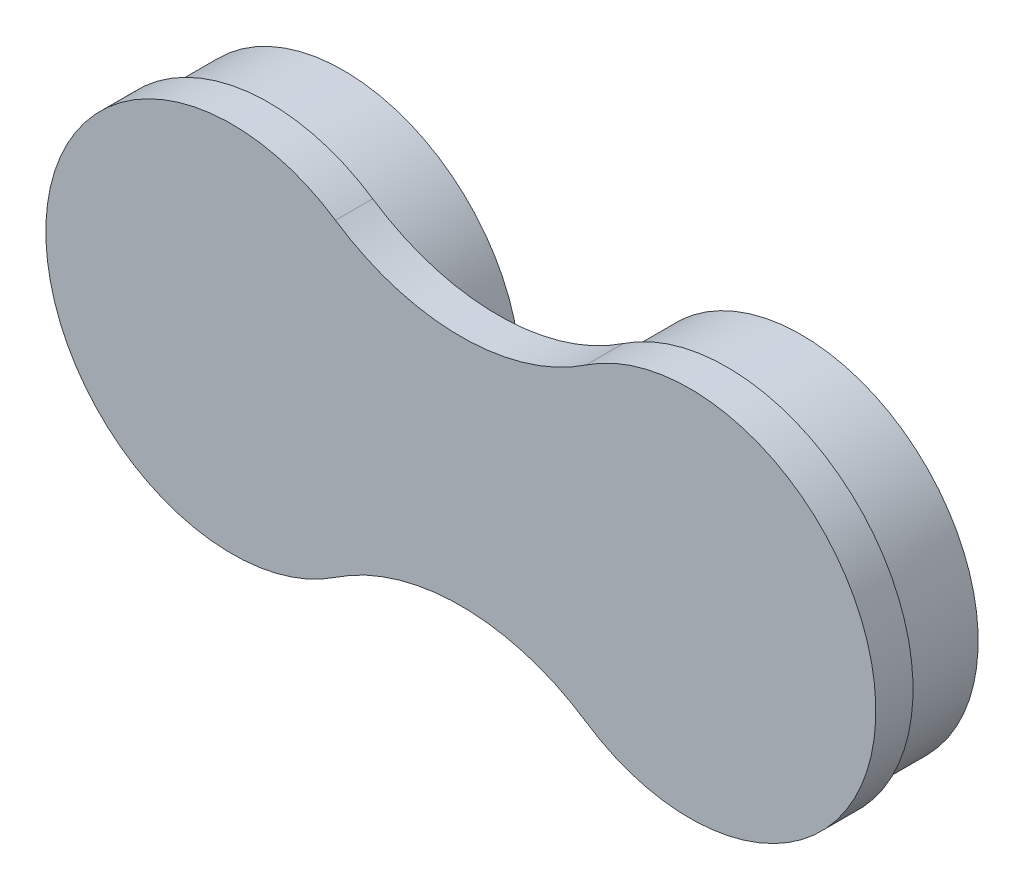
ISO-10303-21;
HEADER;
FILE_DESCRIPTION(('STEP AP214'),'2;1');
FILE_NAME('part.step','',(''),(''),'','','');
FILE_SCHEMA(('AUTOMOTIVE_DESIGN { 1 0 10303 214 1 1 1 1 }'));
ENDSEC;
DATA;
#1=APPLICATION_CONTEXT('core data for automotive mechanical design processes');
#2=APPLICATION_PROTOCOL_DEFINITION('international standard','automotive_design',2000,#1);
#3=PRODUCT_CONTEXT('',#1,'mechanical');
#4=PRODUCT('Part','Part','',(#3));
#5=PRODUCT_RELATED_PRODUCT_CATEGORY('part','',(#4));
#6=PRODUCT_DEFINITION_FORMATION('','',#4);
#7=PRODUCT_DEFINITION_CONTEXT('part definition',#1,'design');
#8=PRODUCT_DEFINITION('design','',#6,#7);
#9=PRODUCT_DEFINITION_SHAPE('','',#8);
#10=(LENGTH_UNIT() NAMED_UNIT(*) SI_UNIT(.MILLI.,.METRE.));
#11=(NAMED_UNIT(*) PLANE_ANGLE_UNIT() SI_UNIT($,.RADIAN.));
#12=(NAMED_UNIT(*) SI_UNIT($,.STERADIAN.) SOLID_ANGLE_UNIT());
#13=UNCERTAINTY_MEASURE_WITH_UNIT(LENGTH_MEASURE(1.E-05),#10,'distance_accuracy_value','');
#14=(GEOMETRIC_REPRESENTATION_CONTEXT(3) GLOBAL_UNCERTAINTY_ASSIGNED_CONTEXT((#13)) GLOBAL_UNIT_ASSIGNED_CONTEXT((#10,
#11,#12)) REPRESENTATION_CONTEXT('',''));
#15=CARTESIAN_POINT('',(0.,0.,0.));
#16=DIRECTION('',(0.,0.,1.));
#17=DIRECTION('',(1.,0.,0.));
#18=AXIS2_PLACEMENT_3D('',#15,#16,#17);
#19=CARTESIAN_POINT('',(3.075,4.59124687907788,2.));
#20=DIRECTION('',(0.,0.,1.));
#21=DIRECTION('',(1.,0.,0.));
#22=AXIS2_PLACEMENT_3D('',#19,#20,#21);
#23=PLANE('',#22);
#24=CARTESIAN_POINT('',(0.,9.18249375815576,2.));
#25=DIRECTION('',(0.,0.,-1.));
#26=DIRECTION('',(1.,0.,0.));
#27=AXIS2_PLACEMENT_3D('',#24,#25,#26);
#28=CIRCLE('',#27,6.05172799242586);
#29=CARTESIAN_POINT('',(3.36762967555173,4.15432490034537,2.));
#30=VERTEX_POINT('',#29);
#31=CARTESIAN_POINT('',(-3.36762967555173,4.15432490034538,2.));
#32=VERTEX_POINT('',#31);
#33=EDGE_CURVE('E101',#30,#32,#28,.T.);
#34=ORIENTED_EDGE('',*,*,#33,.F.);
#35=CARTESIAN_POINT('',(6.15,0.,2.));
#36=DIRECTION('',(0.,0.,1.));
#37=DIRECTION('',(1.,0.,0.));
#38=AXIS2_PLACEMENT_3D('',#35,#36,#37);
#39=CIRCLE('',#38,5.);
#40=CARTESIAN_POINT('',(3.36769025449505,-4.15436547261651,2.));
#41=VERTEX_POINT('',#40);
#42=EDGE_CURVE('E73',#41,#30,#39,.T.);
#43=ORIENTED_EDGE('',*,*,#42,.F.);
#44=CARTESIAN_POINT('',(0.,-9.18278336833941,2.));
#45=DIRECTION('',(0.,0.,-1.));
#46=DIRECTION('',(-1.,0.,0.));
#47=AXIS2_PLACEMENT_3D('',#44,#45,#46);
#48=CIRCLE('',#47,6.05196862056036);
#49=CARTESIAN_POINT('',(-3.36769025449505,-4.15436547261651,2.));
#50=VERTEX_POINT('',#49);
#51=EDGE_CURVE('E67',#50,#41,#48,.T.);
#52=ORIENTED_EDGE('',*,*,#51,.F.);
#53=CARTESIAN_POINT('',(-6.15,0.,2.));
#54=DIRECTION('',(0.,0.,1.));
#55=DIRECTION('',(1.,0.,0.));
#56=AXIS2_PLACEMENT_3D('',#53,#54,#55);
#57=CIRCLE('',#56,5.);
#58=EDGE_CURVE('E91',#32,#50,#57,.T.);
#59=ORIENTED_EDGE('',*,*,#58,.F.);
#60=EDGE_LOOP('',(#34,#43,#52,#59));
#61=FACE_BOUND('',#60,.T.);
#62=CARTESIAN_POINT('',(-6.15,0.,2.));
#63=DIRECTION('',(0.,0.,1.));
#64=DIRECTION('',(1.,0.,0.));
#65=AXIS2_PLACEMENT_3D('',#62,#63,#64);
#66=CIRCLE('',#65,4.75);
#67=CARTESIAN_POINT('',(-1.4,0.,2.));
#68=VERTEX_POINT('',#67);
#69=EDGE_CURVE('E118',#68,#68,#66,.T.);
#70=ORIENTED_EDGE('',*,*,#69,.T.);
#71=EDGE_LOOP('',(#70));
#72=FACE_BOUND('',#71,.T.);
#73=CARTESIAN_POINT('',(6.15,0.,2.));
#74=DIRECTION('',(0.,0.,1.));
#75=DIRECTION('',(1.,0.,0.));
#76=AXIS2_PLACEMENT_3D('',#73,#74,#75);
#77=CIRCLE('',#76,4.75);
#78=CARTESIAN_POINT('',(10.9,0.,2.));
#79=VERTEX_POINT('',#78);
#80=EDGE_CURVE('E11',#79,#79,#77,.F.);
#81=ORIENTED_EDGE('',*,*,#80,.F.);
#82=EDGE_LOOP('',(#81));
#83=FACE_BOUND('',#82,.T.);
#84=ADVANCED_FACE('F33',(#61,#72,#83),#23,.F.);
#85=CARTESIAN_POINT('',(-6.15,0.,2.));
#86=DIRECTION('',(0.,0.,-1.));
#87=DIRECTION('',(-1.,0.,0.));
#88=AXIS2_PLACEMENT_3D('',#85,#86,#87);
#89=CYLINDRICAL_SURFACE('',#88,4.75);
#90=ORIENTED_EDGE('',*,*,#69,.F.);
#91=EDGE_LOOP('',(#90));
#92=FACE_BOUND('',#91,.T.);
#93=CARTESIAN_POINT('',(-6.15,0.,0.));
#94=DIRECTION('',(0.,0.,1.));
#95=DIRECTION('',(1.,0.,0.));
#96=AXIS2_PLACEMENT_3D('',#93,#94,#95);
#97=CIRCLE('',#96,4.75);
#98=CARTESIAN_POINT('',(-1.4,0.,0.));
#99=VERTEX_POINT('',#98);
#100=EDGE_CURVE('E115',#99,#99,#97,.T.);
#101=ORIENTED_EDGE('',*,*,#100,.T.);
#102=EDGE_LOOP('',(#101));
#103=FACE_BOUND('',#102,.T.);
#104=ADVANCED_FACE('F35',(#92,#103),#89,.T.);
#105=CARTESIAN_POINT('',(-6.15,0.,0.));
#106=DIRECTION('',(0.,0.,1.));
#107=DIRECTION('',(1.,0.,0.));
#108=AXIS2_PLACEMENT_3D('',#105,#106,#107);
#109=PLANE('',#108);
#110=CARTESIAN_POINT('',(-6.15,0.,0.));
#111=DIRECTION('',(0.,0.,1.));
#112=DIRECTION('',(1.,0.,0.));
#113=AXIS2_PLACEMENT_3D('',#110,#111,#112);
#114=CIRCLE('',#113,2.25);
#115=CARTESIAN_POINT('',(-3.9,0.,0.));
#116=VERTEX_POINT('',#115);
#117=EDGE_CURVE('E112',#116,#116,#114,.T.);
#118=ORIENTED_EDGE('',*,*,#117,.T.);
#119=EDGE_LOOP('',(#118));
#120=FACE_BOUND('',#119,.T.);
#121=ORIENTED_EDGE('',*,*,#100,.F.);
#122=EDGE_LOOP('',(#121));
#123=FACE_BOUND('',#122,.T.);
#124=ADVANCED_FACE('F150',(#120,#123),#109,.F.);
#125=CARTESIAN_POINT('',(-6.15,0.,0.));
#126=DIRECTION('',(0.,0.,1.));
#127=DIRECTION('',(1.,0.,0.));
#128=AXIS2_PLACEMENT_3D('',#125,#126,#127);
#129=CYLINDRICAL_SURFACE('',#128,2.25);
#130=ORIENTED_EDGE('',*,*,#117,.F.);
#131=EDGE_LOOP('',(#130));
#132=FACE_BOUND('',#131,.T.);
#133=CARTESIAN_POINT('',(-6.15,0.,2.));
#134=DIRECTION('',(0.,0.,1.));
#135=DIRECTION('',(1.,0.,0.));
#136=AXIS2_PLACEMENT_3D('',#133,#134,#135);
#137=CIRCLE('',#136,2.25);
#138=CARTESIAN_POINT('',(-3.9,0.,2.));
#139=VERTEX_POINT('',#138);
#140=EDGE_CURVE('E111',#139,#139,#137,.T.);
#141=ORIENTED_EDGE('',*,*,#140,.T.);
#142=EDGE_LOOP('',(#141));
#143=FACE_BOUND('',#142,.T.);
#144=ADVANCED_FACE('F175',(#132,#143),#129,.F.);
#145=CARTESIAN_POINT('',(3.075,4.59124687907788,3.));
#146=DIRECTION('',(0.,0.,1.));
#147=DIRECTION('',(1.,0.,0.));
#148=AXIS2_PLACEMENT_3D('',#145,#146,#147);
#149=PLANE('',#148);
#150=CARTESIAN_POINT('',(0.,9.18249375815576,3.));
#151=DIRECTION('',(0.,0.,-1.));
#152=DIRECTION('',(1.,0.,0.));
#153=AXIS2_PLACEMENT_3D('',#150,#151,#152);
#154=CIRCLE('',#153,6.05172799242586);
#155=CARTESIAN_POINT('',(3.36762967555173,4.15432490034537,3.));
#156=VERTEX_POINT('',#155);
#157=CARTESIAN_POINT('',(-3.36762967555173,4.15432490034538,3.));
#158=VERTEX_POINT('',#157);
#159=EDGE_CURVE('E86',#156,#158,#154,.T.);
#160=ORIENTED_EDGE('',*,*,#159,.T.);
#161=CARTESIAN_POINT('',(-6.15,0.,3.));
#162=DIRECTION('',(0.,0.,1.));
#163=DIRECTION('',(1.,0.,0.));
#164=AXIS2_PLACEMENT_3D('',#161,#162,#163);
#165=CIRCLE('',#164,5.);
#166=CARTESIAN_POINT('',(-3.36769025449505,-4.15436547261651,3.));
#167=VERTEX_POINT('',#166);
#168=EDGE_CURVE('E81',#158,#167,#165,.T.);
#169=ORIENTED_EDGE('',*,*,#168,.T.);
#170=CARTESIAN_POINT('',(0.,-9.18278336833941,3.));
#171=DIRECTION('',(0.,0.,-1.));
#172=DIRECTION('',(-1.,0.,0.));
#173=AXIS2_PLACEMENT_3D('',#170,#171,#172);
#174=CIRCLE('',#173,6.05196862056036);
#175=CARTESIAN_POINT('',(3.36769025449505,-4.15436547261651,3.));
#176=VERTEX_POINT('',#175);
#177=EDGE_CURVE('E84',#167,#176,#174,.T.);
#178=ORIENTED_EDGE('',*,*,#177,.T.);
#179=CARTESIAN_POINT('',(6.15,0.,3.));
#180=DIRECTION('',(0.,0.,1.));
#181=DIRECTION('',(1.,0.,0.));
#182=AXIS2_PLACEMENT_3D('',#179,#180,#181);
#183=CIRCLE('',#182,5.);
#184=EDGE_CURVE('E50',#176,#156,#183,.T.);
#185=ORIENTED_EDGE('',*,*,#184,.T.);
#186=EDGE_LOOP('',(#160,#169,#178,#185));
#187=FACE_BOUND('',#186,.T.);
#188=ADVANCED_FACE('F82',(#187),#149,.T.);
#189=CARTESIAN_POINT('',(6.15,0.,3.));
#190=DIRECTION('',(0.,0.,-1.));
#191=DIRECTION('',(-1.,0.,0.));
#192=AXIS2_PLACEMENT_3D('',#189,#190,#191);
#193=CYLINDRICAL_SURFACE('',#192,5.);
#194=ORIENTED_EDGE('',*,*,#42,.T.);
#195=DIRECTION('',(0.,0.,-1.));
#196=VECTOR('',#195,1.);
#197=CARTESIAN_POINT('',(3.36762967555173,4.15432490034537,3.));
#198=LINE('',#197,#196);
#199=EDGE_CURVE('E97',#156,#30,#198,.T.);
#200=ORIENTED_EDGE('',*,*,#199,.F.);
#201=ORIENTED_EDGE('',*,*,#184,.F.);
#202=DIRECTION('',(0.,0.,-1.));
#203=VECTOR('',#202,1.);
#204=CARTESIAN_POINT('',(3.36769025449505,-4.15436547261651,3.));
#205=LINE('',#204,#203);
#206=EDGE_CURVE('E93',#176,#41,#205,.T.);
#207=ORIENTED_EDGE('',*,*,#206,.T.);
#208=EDGE_LOOP('',(#194,#200,#201,#207));
#209=FACE_BOUND('',#208,.T.);
#210=ADVANCED_FACE('F174',(#209),#193,.T.);
#211=CARTESIAN_POINT('',(0.,-9.18278336833941,3.));
#212=DIRECTION('',(0.,0.,-1.));
#213=DIRECTION('',(-1.,0.,0.));
#214=AXIS2_PLACEMENT_3D('',#211,#212,#213);
#215=CYLINDRICAL_SURFACE('',#214,6.05196862056036);
#216=ORIENTED_EDGE('',*,*,#51,.T.);
#217=ORIENTED_EDGE('',*,*,#206,.F.);
#218=ORIENTED_EDGE('',*,*,#177,.F.);
#219=DIRECTION('',(0.,0.,-1.));
#220=VECTOR('',#219,1.);
#221=CARTESIAN_POINT('',(-3.36769025449505,-4.15436547261651,3.));
#222=LINE('',#221,#220);
#223=EDGE_CURVE('E89',#167,#50,#222,.T.);
#224=ORIENTED_EDGE('',*,*,#223,.T.);
#225=EDGE_LOOP('',(#216,#217,#218,#224));
#226=FACE_BOUND('',#225,.T.);
#227=ADVANCED_FACE('F95',(#226),#215,.F.);
#228=CARTESIAN_POINT('',(-6.15,0.,3.));
#229=DIRECTION('',(0.,0.,-1.));
#230=DIRECTION('',(-1.,0.,0.));
#231=AXIS2_PLACEMENT_3D('',#228,#229,#230);
#232=CYLINDRICAL_SURFACE('',#231,5.);
#233=ORIENTED_EDGE('',*,*,#58,.T.);
#234=ORIENTED_EDGE('',*,*,#223,.F.);
#235=ORIENTED_EDGE('',*,*,#168,.F.);
#236=DIRECTION('',(0.,0.,-1.));
#237=VECTOR('',#236,1.);
#238=CARTESIAN_POINT('',(-3.36762967555173,4.15432490034538,3.));
#239=LINE('',#238,#237);
#240=EDGE_CURVE('E92',#158,#32,#239,.T.);
#241=ORIENTED_EDGE('',*,*,#240,.T.);
#242=EDGE_LOOP('',(#233,#234,#235,#241));
#243=FACE_BOUND('',#242,.T.);
#244=ADVANCED_FACE('F90',(#243),#232,.T.);
#245=CARTESIAN_POINT('',(0.,9.18249375815576,3.));
#246=DIRECTION('',(0.,0.,-1.));
#247=DIRECTION('',(-1.,0.,0.));
#248=AXIS2_PLACEMENT_3D('',#245,#246,#247);
#249=CYLINDRICAL_SURFACE('',#248,6.05172799242586);
#250=ORIENTED_EDGE('',*,*,#33,.T.);
#251=ORIENTED_EDGE('',*,*,#240,.F.);
#252=ORIENTED_EDGE('',*,*,#159,.F.);
#253=ORIENTED_EDGE('',*,*,#199,.T.);
#254=EDGE_LOOP('',(#250,#251,#252,#253));
#255=FACE_BOUND('',#254,.T.);
#256=ADVANCED_FACE('F141',(#255),#249,.F.);
#257=ORIENTED_EDGE('',*,*,#140,.F.);
#258=EDGE_LOOP('',(#257));
#259=FACE_BOUND('',#258,.T.);
#260=ADVANCED_FACE('F130',(#259),#23,.F.);
#261=CARTESIAN_POINT('',(6.15,0.,2.));
#262=DIRECTION('',(0.,0.,-1.));
#263=DIRECTION('',(-1.,0.,0.));
#264=AXIS2_PLACEMENT_3D('',#261,#262,#263);
#265=CYLINDRICAL_SURFACE('',#264,4.75);
#266=ORIENTED_EDGE('',*,*,#80,.T.);
#267=EDGE_LOOP('',(#266));
#268=FACE_BOUND('',#267,.T.);
#269=CARTESIAN_POINT('',(6.15,0.,0.));
#270=DIRECTION('',(0.,0.,1.));
#271=DIRECTION('',(-1.,0.,0.));
#272=AXIS2_PLACEMENT_3D('',#269,#270,#271);
#273=CIRCLE('',#272,4.75);
#274=CARTESIAN_POINT('',(1.4,0.,0.));
#275=VERTEX_POINT('',#274);
#276=EDGE_CURVE('E104',#275,#275,#273,.T.);
#277=ORIENTED_EDGE('',*,*,#276,.T.);
#278=EDGE_LOOP('',(#277));
#279=FACE_BOUND('',#278,.T.);
#280=ADVANCED_FACE('F140',(#268,#279),#265,.T.);
#281=CARTESIAN_POINT('',(6.15,0.,0.));
#282=DIRECTION('',(0.,0.,-1.));
#283=DIRECTION('',(-1.,0.,0.));
#284=AXIS2_PLACEMENT_3D('',#281,#282,#283);
#285=PLANE('',#284);
#286=CARTESIAN_POINT('',(6.15,0.,0.));
#287=DIRECTION('',(0.,0.,1.));
#288=DIRECTION('',(1.,0.,0.));
#289=AXIS2_PLACEMENT_3D('',#286,#287,#288);
#290=CIRCLE('',#289,2.25);
#291=CARTESIAN_POINT('',(8.4,0.,0.));
#292=VERTEX_POINT('',#291);
#293=EDGE_CURVE('E164',#292,#292,#290,.T.);
#294=ORIENTED_EDGE('',*,*,#293,.T.);
#295=EDGE_LOOP('',(#294));
#296=FACE_BOUND('',#295,.T.);
#297=ORIENTED_EDGE('',*,*,#276,.F.);
#298=EDGE_LOOP('',(#297));
#299=FACE_BOUND('',#298,.T.);
#300=ADVANCED_FACE('F135',(#296,#299),#285,.T.);
#301=CARTESIAN_POINT('',(6.15,0.,0.));
#302=DIRECTION('',(0.,0.,1.));
#303=DIRECTION('',(1.,0.,0.));
#304=AXIS2_PLACEMENT_3D('',#301,#302,#303);
#305=CYLINDRICAL_SURFACE('',#304,2.25);
#306=ORIENTED_EDGE('',*,*,#293,.F.);
#307=EDGE_LOOP('',(#306));
#308=FACE_BOUND('',#307,.T.);
#309=CARTESIAN_POINT('',(6.15,0.,2.));
#310=DIRECTION('',(0.,0.,1.));
#311=DIRECTION('',(1.,0.,0.));
#312=AXIS2_PLACEMENT_3D('',#309,#310,#311);
#313=CIRCLE('',#312,2.25);
#314=CARTESIAN_POINT('',(8.4,0.,2.));
#315=VERTEX_POINT('',#314);
#316=EDGE_CURVE('E42',#315,#315,#313,.T.);
#317=ORIENTED_EDGE('',*,*,#316,.T.);
#318=EDGE_LOOP('',(#317));
#319=FACE_BOUND('',#318,.T.);
#320=ADVANCED_FACE('F125',(#308,#319),#305,.F.);
#321=ORIENTED_EDGE('',*,*,#316,.F.);
#322=EDGE_LOOP('',(#321));
#323=FACE_BOUND('',#322,.T.);
#324=ADVANCED_FACE('F127',(#323),#23,.F.);
#325=CLOSED_SHELL('',(#84,#104,#124,#144,#188,#210,#227,#244,#256,#260,#280,#300,#320,#324));
#326=MANIFOLD_SOLID_BREP('B2',#325);
#327=ADVANCED_BREP_SHAPE_REPRESENTATION('',(#18,#326),#14);
#328=SHAPE_DEFINITION_REPRESENTATION(#9,#327);
ENDSEC;
END-ISO-10303-21;
